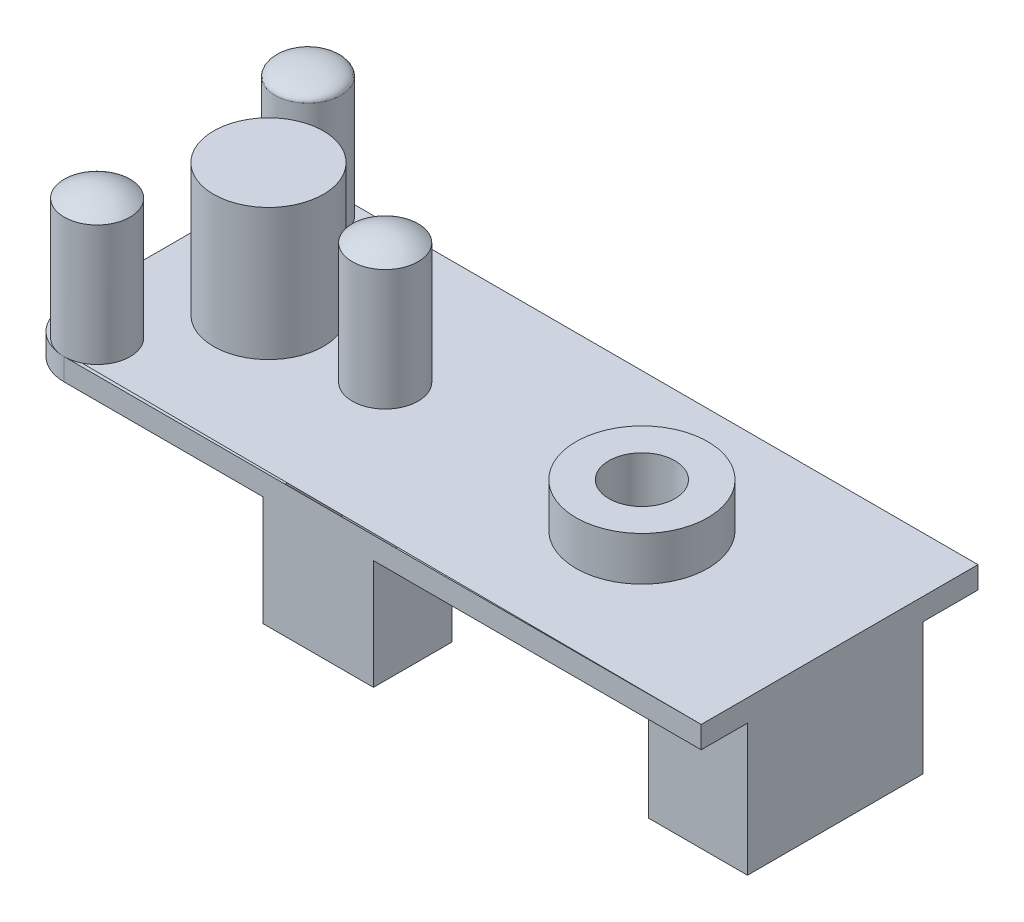
ISO-10303-21;
HEADER;
FILE_DESCRIPTION(('STEP AP214'),'2;1');
FILE_NAME('part.step','',(''),(''),'','','');
FILE_SCHEMA(('AUTOMOTIVE_DESIGN { 1 0 10303 214 1 1 1 1 }'));
ENDSEC;
DATA;
#1=APPLICATION_CONTEXT('core data for automotive mechanical design processes');
#2=APPLICATION_PROTOCOL_DEFINITION('international standard','automotive_design',2000,#1);
#3=PRODUCT_CONTEXT('',#1,'mechanical');
#4=PRODUCT('Part','Part','',(#3));
#5=PRODUCT_RELATED_PRODUCT_CATEGORY('part','',(#4));
#6=PRODUCT_DEFINITION_FORMATION('','',#4);
#7=PRODUCT_DEFINITION_CONTEXT('part definition',#1,'design');
#8=PRODUCT_DEFINITION('design','',#6,#7);
#9=PRODUCT_DEFINITION_SHAPE('','',#8);
#10=(LENGTH_UNIT() NAMED_UNIT(*) SI_UNIT(.MILLI.,.METRE.));
#11=(NAMED_UNIT(*) PLANE_ANGLE_UNIT() SI_UNIT($,.RADIAN.));
#12=(NAMED_UNIT(*) SI_UNIT($,.STERADIAN.) SOLID_ANGLE_UNIT());
#13=UNCERTAINTY_MEASURE_WITH_UNIT(LENGTH_MEASURE(1.E-05),#10,'distance_accuracy_value','');
#14=(GEOMETRIC_REPRESENTATION_CONTEXT(3) GLOBAL_UNCERTAINTY_ASSIGNED_CONTEXT((#13)) GLOBAL_UNIT_ASSIGNED_CONTEXT((#10,
#11,#12)) REPRESENTATION_CONTEXT('',''));
#15=CARTESIAN_POINT('',(0.,0.,0.));
#16=DIRECTION('',(0.,0.,1.));
#17=DIRECTION('',(1.,0.,0.));
#18=AXIS2_PLACEMENT_3D('',#15,#16,#17);
#19=CARTESIAN_POINT('',(0.,0.,0.));
#20=DIRECTION('',(0.,1.,0.));
#21=DIRECTION('',(0.,0.,1.));
#22=AXIS2_PLACEMENT_3D('',#19,#20,#21);
#23=PLANE('',#22);
#24=CARTESIAN_POINT('',(6.5,0.,0.));
#25=DIRECTION('',(0.,1.,0.));
#26=DIRECTION('',(0.,0.,1.));
#27=AXIS2_PLACEMENT_3D('',#24,#25,#26);
#28=CIRCLE('',#27,1.5);
#29=CARTESIAN_POINT('',(6.5,0.,1.5));
#30=VERTEX_POINT('',#29);
#31=EDGE_CURVE('E421',#30,#30,#28,.T.);
#32=ORIENTED_EDGE('',*,*,#31,.T.);
#33=EDGE_LOOP('',(#32));
#34=FACE_BOUND('',#33,.T.);
#35=DIRECTION('',(0.,0.,-1.));
#36=VECTOR('',#35,1.);
#37=CARTESIAN_POINT('',(-4.44020088302612,0.,6.3));
#38=LINE('',#37,#36);
#39=CARTESIAN_POINT('',(-4.44020088302612,0.,6.3));
#40=VERTEX_POINT('',#39);
#41=CARTESIAN_POINT('',(-4.44020088302612,0.,2.71883396460657));
#42=VERTEX_POINT('',#41);
#43=EDGE_CURVE('E185',#40,#42,#38,.T.);
#44=ORIENTED_EDGE('',*,*,#43,.F.);
#45=DIRECTION('',(1.,0.,0.));
#46=VECTOR('',#45,1.);
#47=CARTESIAN_POINT('',(-15.5,0.,6.3));
#48=LINE('',#47,#46);
#49=CARTESIAN_POINT('',(-13.5,0.,6.3));
#50=VERTEX_POINT('',#49);
#51=EDGE_CURVE('E311',#50,#40,#48,.T.);
#52=ORIENTED_EDGE('',*,*,#51,.F.);
#53=CARTESIAN_POINT('',(-13.5,0.,4.3));
#54=DIRECTION('',(0.,1.,0.));
#55=DIRECTION('',(0.,0.,1.));
#56=AXIS2_PLACEMENT_3D('',#53,#54,#55);
#57=CIRCLE('',#56,2.);
#58=CARTESIAN_POINT('',(-15.5,0.,4.3));
#59=VERTEX_POINT('',#58);
#60=EDGE_CURVE('E251',#50,#59,#57,.F.);
#61=ORIENTED_EDGE('',*,*,#60,.T.);
#62=DIRECTION('',(0.,0.,1.));
#63=VECTOR('',#62,1.);
#64=CARTESIAN_POINT('',(-15.5,0.,-6.3));
#65=LINE('',#64,#63);
#66=CARTESIAN_POINT('',(-15.5,0.,-4.3));
#67=VERTEX_POINT('',#66);
#68=EDGE_CURVE('E689',#67,#59,#65,.T.);
#69=ORIENTED_EDGE('',*,*,#68,.F.);
#70=CARTESIAN_POINT('',(-13.5,0.,-4.3));
#71=DIRECTION('',(0.,1.,0.));
#72=DIRECTION('',(0.,0.,1.));
#73=AXIS2_PLACEMENT_3D('',#70,#71,#72);
#74=CIRCLE('',#73,2.);
#75=CARTESIAN_POINT('',(-13.5,0.,-6.3));
#76=VERTEX_POINT('',#75);
#77=EDGE_CURVE('E57',#67,#76,#74,.F.);
#78=ORIENTED_EDGE('',*,*,#77,.T.);
#79=DIRECTION('',(-1.,0.,0.));
#80=VECTOR('',#79,1.);
#81=CARTESIAN_POINT('',(-15.5,0.,-6.3));
#82=LINE('',#81,#80);
#83=CARTESIAN_POINT('',(15.5,0.,-6.3));
#84=VERTEX_POINT('',#83);
#85=EDGE_CURVE('E284',#84,#76,#82,.T.);
#86=ORIENTED_EDGE('',*,*,#85,.F.);
#87=DIRECTION('',(0.,0.,-1.));
#88=VECTOR('',#87,1.);
#89=CARTESIAN_POINT('',(15.5,0.,-6.3));
#90=LINE('',#89,#88);
#91=CARTESIAN_POINT('',(15.5,0.,-3.80656899501454));
#92=VERTEX_POINT('',#91);
#93=EDGE_CURVE('E305',#92,#84,#90,.T.);
#94=ORIENTED_EDGE('',*,*,#93,.F.);
#95=DIRECTION('',(1.,0.,0.));
#96=VECTOR('',#95,1.);
#97=CARTESIAN_POINT('',(11.,0.,-3.80656899501453));
#98=LINE('',#97,#96);
#99=CARTESIAN_POINT('',(11.,0.,-3.80656899501453));
#100=VERTEX_POINT('',#99);
#101=EDGE_CURVE('E217',#100,#92,#98,.T.);
#102=ORIENTED_EDGE('',*,*,#101,.F.);
#103=DIRECTION('',(0.,0.,-1.));
#104=VECTOR('',#103,1.);
#105=CARTESIAN_POINT('',(10.9999999999999,0.,4.19343100498547));
#106=LINE('',#105,#104);
#107=CARTESIAN_POINT('',(10.9999999999999,0.,4.19343100498547));
#108=VERTEX_POINT('',#107);
#109=EDGE_CURVE('E228',#108,#100,#106,.T.);
#110=ORIENTED_EDGE('',*,*,#109,.F.);
#111=DIRECTION('',(-1.,0.,0.));
#112=VECTOR('',#111,1.);
#113=CARTESIAN_POINT('',(15.5,0.,4.19343100498549));
#114=LINE('',#113,#112);
#115=CARTESIAN_POINT('',(15.5,0.,4.19343100498548));
#116=VERTEX_POINT('',#115);
#117=EDGE_CURVE('E242',#116,#108,#114,.T.);
#118=ORIENTED_EDGE('',*,*,#117,.F.);
#119=CARTESIAN_POINT('',(15.5,0.,6.3));
#120=VERTEX_POINT('',#119);
#121=EDGE_CURVE('E322',#120,#116,#90,.T.);
#122=ORIENTED_EDGE('',*,*,#121,.F.);
#123=CARTESIAN_POINT('',(0.579184897786012,0.,6.3));
#124=VERTEX_POINT('',#123);
#125=EDGE_CURVE('E688',#124,#120,#48,.T.);
#126=ORIENTED_EDGE('',*,*,#125,.F.);
#127=DIRECTION('',(0.,0.,1.));
#128=VECTOR('',#127,1.);
#129=CARTESIAN_POINT('',(0.579184897786012,0.,6.3));
#130=LINE('',#129,#128);
#131=CARTESIAN_POINT('',(0.579184897786012,0.,2.71883396460657));
#132=VERTEX_POINT('',#131);
#133=EDGE_CURVE('E181',#132,#124,#130,.T.);
#134=ORIENTED_EDGE('',*,*,#133,.F.);
#135=DIRECTION('',(1.,0.,0.));
#136=VECTOR('',#135,1.);
#137=CARTESIAN_POINT('',(-4.44020088302612,0.,2.71883396460657));
#138=LINE('',#137,#136);
#139=EDGE_CURVE('E686',#42,#132,#138,.T.);
#140=ORIENTED_EDGE('',*,*,#139,.F.);
#141=EDGE_LOOP('',(#44,#52,#61,#69,#78,#86,#94,#102,#110,#118,#122,#126,#134,#140));
#142=FACE_BOUND('',#141,.T.);
#143=ADVANCED_FACE('F34',(#34,#142),#23,.F.);
#144=CARTESIAN_POINT('',(0.,1.,0.));
#145=DIRECTION('',(0.,1.,0.));
#146=DIRECTION('',(0.,0.,1.));
#147=AXIS2_PLACEMENT_3D('',#144,#145,#146);
#148=PLANE('',#147);
#149=CARTESIAN_POINT('',(-5.1861561236694,1.,0.));
#150=DIRECTION('',(0.,1.,0.));
#151=DIRECTION('',(0.,0.,1.));
#152=AXIS2_PLACEMENT_3D('',#149,#150,#151);
#153=CIRCLE('',#152,1.5);
#154=CARTESIAN_POINT('',(-5.1861561236694,1.,1.5));
#155=VERTEX_POINT('',#154);
#156=EDGE_CURVE('E294',#155,#155,#153,.T.);
#157=ORIENTED_EDGE('',*,*,#156,.F.);
#158=EDGE_LOOP('',(#157));
#159=FACE_BOUND('',#158,.T.);
#160=CARTESIAN_POINT('',(-10.5,1.,0.));
#161=DIRECTION('',(0.,1.,0.));
#162=DIRECTION('',(0.,0.,1.));
#163=AXIS2_PLACEMENT_3D('',#160,#161,#162);
#164=CIRCLE('',#163,2.5);
#165=CARTESIAN_POINT('',(-10.5,1.,2.5));
#166=VERTEX_POINT('',#165);
#167=EDGE_CURVE('E306',#166,#166,#164,.T.);
#168=ORIENTED_EDGE('',*,*,#167,.F.);
#169=EDGE_LOOP('',(#168));
#170=FACE_BOUND('',#169,.T.);
#171=CARTESIAN_POINT('',(-13.5,1.,-4.8));
#172=DIRECTION('',(0.,1.,0.));
#173=DIRECTION('',(0.,0.,-1.));
#174=AXIS2_PLACEMENT_3D('',#171,#172,#173);
#175=CIRCLE('',#174,1.5);
#176=CARTESIAN_POINT('',(-13.5,1.,-6.3));
#177=VERTEX_POINT('',#176);
#178=EDGE_CURVE('E268',#177,#177,#175,.T.);
#179=ORIENTED_EDGE('',*,*,#178,.F.);
#180=CARTESIAN_POINT('',(-13.5,1.,-4.3));
#181=DIRECTION('',(0.,1.,0.));
#182=DIRECTION('',(0.,0.,1.));
#183=AXIS2_PLACEMENT_3D('',#180,#181,#182);
#184=CIRCLE('',#183,2.);
#185=CARTESIAN_POINT('',(-15.5,1.,-4.3));
#186=VERTEX_POINT('',#185);
#187=EDGE_CURVE('E42',#177,#186,#184,.T.);
#188=ORIENTED_EDGE('',*,*,#187,.T.);
#189=DIRECTION('',(0.,0.,1.));
#190=VECTOR('',#189,1.);
#191=CARTESIAN_POINT('',(-15.5,1.,-6.3));
#192=LINE('',#191,#190);
#193=CARTESIAN_POINT('',(-15.5,1.,4.3));
#194=VERTEX_POINT('',#193);
#195=EDGE_CURVE('E264',#186,#194,#192,.T.);
#196=ORIENTED_EDGE('',*,*,#195,.T.);
#197=CARTESIAN_POINT('',(-13.5,1.,4.3));
#198=DIRECTION('',(0.,1.,0.));
#199=DIRECTION('',(0.,0.,1.));
#200=AXIS2_PLACEMENT_3D('',#197,#198,#199);
#201=CIRCLE('',#200,2.);
#202=CARTESIAN_POINT('',(-13.5,1.,6.3));
#203=VERTEX_POINT('',#202);
#204=EDGE_CURVE('E256',#194,#203,#201,.T.);
#205=ORIENTED_EDGE('',*,*,#204,.T.);
#206=CARTESIAN_POINT('',(-13.5,1.,4.8));
#207=DIRECTION('',(0.,1.,0.));
#208=DIRECTION('',(0.,0.,1.));
#209=AXIS2_PLACEMENT_3D('',#206,#207,#208);
#210=CIRCLE('',#209,1.5);
#211=EDGE_CURVE('E291',#203,#203,#210,.T.);
#212=ORIENTED_EDGE('',*,*,#211,.F.);
#213=DIRECTION('',(1.,0.,0.));
#214=VECTOR('',#213,1.);
#215=CARTESIAN_POINT('',(-15.5,1.,6.3));
#216=LINE('',#215,#214);
#217=CARTESIAN_POINT('',(15.5,1.,6.3));
#218=VERTEX_POINT('',#217);
#219=EDGE_CURVE('E276',#203,#218,#216,.T.);
#220=ORIENTED_EDGE('',*,*,#219,.T.);
#221=DIRECTION('',(0.,0.,-1.));
#222=VECTOR('',#221,1.);
#223=CARTESIAN_POINT('',(15.5,1.,-6.3));
#224=LINE('',#223,#222);
#225=CARTESIAN_POINT('',(15.5,1.,-6.3));
#226=VERTEX_POINT('',#225);
#227=EDGE_CURVE('E309',#218,#226,#224,.T.);
#228=ORIENTED_EDGE('',*,*,#227,.T.);
#229=DIRECTION('',(-1.,0.,0.));
#230=VECTOR('',#229,1.);
#231=CARTESIAN_POINT('',(-15.5,1.,-6.3));
#232=LINE('',#231,#230);
#233=EDGE_CURVE('E277',#226,#177,#232,.T.);
#234=ORIENTED_EDGE('',*,*,#233,.T.);
#235=EDGE_LOOP('',(#179,#188,#196,#205,#212,#220,#228,#234));
#236=FACE_BOUND('',#235,.T.);
#237=CARTESIAN_POINT('',(6.5,1.,0.));
#238=DIRECTION('',(0.,1.,0.));
#239=DIRECTION('',(0.,0.,1.));
#240=AXIS2_PLACEMENT_3D('',#237,#238,#239);
#241=CIRCLE('',#240,3.);
#242=CARTESIAN_POINT('',(6.5,1.,3.));
#243=VERTEX_POINT('',#242);
#244=EDGE_CURVE('E417',#243,#243,#241,.T.);
#245=ORIENTED_EDGE('',*,*,#244,.F.);
#246=EDGE_LOOP('',(#245));
#247=FACE_BOUND('',#246,.T.);
#248=ADVANCED_FACE('F262',(#159,#170,#236,#247),#148,.T.);
#249=CARTESIAN_POINT('',(15.5,1.,-6.3));
#250=DIRECTION('',(-1.,0.,0.));
#251=DIRECTION('',(0.,0.,1.));
#252=AXIS2_PLACEMENT_3D('',#249,#250,#251);
#253=PLANE('',#252);
#254=ORIENTED_EDGE('',*,*,#121,.T.);
#255=DIRECTION('',(0.,1.,0.));
#256=VECTOR('',#255,1.);
#257=CARTESIAN_POINT('',(15.5,-6.,4.19343100498549));
#258=LINE('',#257,#256);
#259=CARTESIAN_POINT('',(15.5,-6.,4.19343100498549));
#260=VERTEX_POINT('',#259);
#261=EDGE_CURVE('E384',#260,#116,#258,.T.);
#262=ORIENTED_EDGE('',*,*,#261,.F.);
#263=DIRECTION('',(0.,0.,1.));
#264=VECTOR('',#263,1.);
#265=CARTESIAN_POINT('',(15.5,-6.,-3.80656899501454));
#266=LINE('',#265,#264);
#267=CARTESIAN_POINT('',(15.5,-6.,-3.80656899501454));
#268=VERTEX_POINT('',#267);
#269=EDGE_CURVE('E227',#268,#260,#266,.T.);
#270=ORIENTED_EDGE('',*,*,#269,.F.);
#271=DIRECTION('',(0.,1.,0.));
#272=VECTOR('',#271,1.);
#273=CARTESIAN_POINT('',(15.5,-6.,-3.80656899501454));
#274=LINE('',#273,#272);
#275=EDGE_CURVE('E394',#268,#92,#274,.T.);
#276=ORIENTED_EDGE('',*,*,#275,.T.);
#277=ORIENTED_EDGE('',*,*,#93,.T.);
#278=DIRECTION('',(0.,-1.,0.));
#279=VECTOR('',#278,1.);
#280=CARTESIAN_POINT('',(15.5,1.,-6.3));
#281=LINE('',#280,#279);
#282=EDGE_CURVE('E248',#226,#84,#281,.T.);
#283=ORIENTED_EDGE('',*,*,#282,.F.);
#284=ORIENTED_EDGE('',*,*,#227,.F.);
#285=DIRECTION('',(0.,-1.,0.));
#286=VECTOR('',#285,1.);
#287=CARTESIAN_POINT('',(15.5,1.,6.3));
#288=LINE('',#287,#286);
#289=EDGE_CURVE('E314',#218,#120,#288,.T.);
#290=ORIENTED_EDGE('',*,*,#289,.T.);
#291=EDGE_LOOP('',(#254,#262,#270,#276,#277,#283,#284,#290));
#292=FACE_BOUND('',#291,.T.);
#293=ADVANCED_FACE('F336',(#292),#253,.F.);
#294=CARTESIAN_POINT('',(-15.5,1.,-6.3));
#295=DIRECTION('',(0.,0.,1.));
#296=DIRECTION('',(1.,0.,0.));
#297=AXIS2_PLACEMENT_3D('',#294,#295,#296);
#298=PLANE('',#297);
#299=ORIENTED_EDGE('',*,*,#85,.T.);
#300=DIRECTION('',(0.,-1.,0.));
#301=VECTOR('',#300,1.);
#302=CARTESIAN_POINT('',(-13.5,1.,-6.3));
#303=LINE('',#302,#301);
#304=EDGE_CURVE('E254',#76,#177,#303,.F.);
#305=ORIENTED_EDGE('',*,*,#304,.T.);
#306=ORIENTED_EDGE('',*,*,#233,.F.);
#307=ORIENTED_EDGE('',*,*,#282,.T.);
#308=EDGE_LOOP('',(#299,#305,#306,#307));
#309=FACE_BOUND('',#308,.T.);
#310=ADVANCED_FACE('F281',(#309),#298,.F.);
#311=CARTESIAN_POINT('',(-15.5,1.,-6.3));
#312=DIRECTION('',(1.,0.,0.));
#313=DIRECTION('',(0.,0.,-1.));
#314=AXIS2_PLACEMENT_3D('',#311,#312,#313);
#315=PLANE('',#314);
#316=ORIENTED_EDGE('',*,*,#195,.F.);
#317=DIRECTION('',(0.,-1.,0.));
#318=VECTOR('',#317,1.);
#319=CARTESIAN_POINT('',(-15.5,1.,-4.3));
#320=LINE('',#319,#318);
#321=EDGE_CURVE('E247',#186,#67,#320,.T.);
#322=ORIENTED_EDGE('',*,*,#321,.T.);
#323=ORIENTED_EDGE('',*,*,#68,.T.);
#324=DIRECTION('',(0.,-1.,0.));
#325=VECTOR('',#324,1.);
#326=CARTESIAN_POINT('',(-15.5,1.,4.3));
#327=LINE('',#326,#325);
#328=EDGE_CURVE('E245',#59,#194,#327,.F.);
#329=ORIENTED_EDGE('',*,*,#328,.T.);
#330=EDGE_LOOP('',(#316,#322,#323,#329));
#331=FACE_BOUND('',#330,.T.);
#332=ADVANCED_FACE('F273',(#331),#315,.F.);
#333=CARTESIAN_POINT('',(-15.5,1.,6.3));
#334=DIRECTION('',(0.,0.,-1.));
#335=DIRECTION('',(-1.,0.,0.));
#336=AXIS2_PLACEMENT_3D('',#333,#334,#335);
#337=PLANE('',#336);
#338=ORIENTED_EDGE('',*,*,#219,.F.);
#339=DIRECTION('',(0.,-1.,0.));
#340=VECTOR('',#339,1.);
#341=CARTESIAN_POINT('',(-13.5,1.,6.3));
#342=LINE('',#341,#340);
#343=EDGE_CURVE('E11',#203,#50,#342,.T.);
#344=ORIENTED_EDGE('',*,*,#343,.T.);
#345=ORIENTED_EDGE('',*,*,#51,.T.);
#346=DIRECTION('',(0.,1.,0.));
#347=VECTOR('',#346,1.);
#348=CARTESIAN_POINT('',(-4.44020088302612,-5.,6.3));
#349=LINE('',#348,#347);
#350=CARTESIAN_POINT('',(-4.44020088302612,-5.,6.3));
#351=VERTEX_POINT('',#350);
#352=EDGE_CURVE('E699',#351,#40,#349,.T.);
#353=ORIENTED_EDGE('',*,*,#352,.F.);
#354=DIRECTION('',(-1.,0.,0.));
#355=VECTOR('',#354,1.);
#356=CARTESIAN_POINT('',(-4.44020088302612,-5.,6.3));
#357=LINE('',#356,#355);
#358=CARTESIAN_POINT('',(0.579184897786012,-5.,6.3));
#359=VERTEX_POINT('',#358);
#360=EDGE_CURVE('E178',#359,#351,#357,.T.);
#361=ORIENTED_EDGE('',*,*,#360,.F.);
#362=DIRECTION('',(0.,1.,0.));
#363=VECTOR('',#362,1.);
#364=CARTESIAN_POINT('',(0.579184897786012,-5.,6.3));
#365=LINE('',#364,#363);
#366=EDGE_CURVE('E49',#359,#124,#365,.T.);
#367=ORIENTED_EDGE('',*,*,#366,.T.);
#368=ORIENTED_EDGE('',*,*,#125,.T.);
#369=ORIENTED_EDGE('',*,*,#289,.F.);
#370=EDGE_LOOP('',(#338,#344,#345,#353,#361,#367,#368,#369));
#371=FACE_BOUND('',#370,.T.);
#372=ADVANCED_FACE('F368',(#371),#337,.F.);
#373=CARTESIAN_POINT('',(-10.5,7.,0.));
#374=DIRECTION('',(0.,-1.,0.));
#375=DIRECTION('',(0.,0.,-1.));
#376=AXIS2_PLACEMENT_3D('',#373,#374,#375);
#377=CYLINDRICAL_SURFACE('',#376,2.5);
#378=CARTESIAN_POINT('',(-10.5,7.,0.));
#379=DIRECTION('',(0.,1.,0.));
#380=DIRECTION('',(0.,0.,1.));
#381=AXIS2_PLACEMENT_3D('',#378,#379,#380);
#382=CIRCLE('',#381,2.5);
#383=CARTESIAN_POINT('',(-10.5,7.,2.5));
#384=VERTEX_POINT('',#383);
#385=EDGE_CURVE('E302',#384,#384,#382,.T.);
#386=ORIENTED_EDGE('',*,*,#385,.F.);
#387=EDGE_LOOP('',(#386));
#388=FACE_BOUND('',#387,.T.);
#389=ORIENTED_EDGE('',*,*,#167,.T.);
#390=EDGE_LOOP('',(#389));
#391=FACE_BOUND('',#390,.T.);
#392=ADVANCED_FACE('F371',(#388,#391),#377,.T.);
#393=CARTESIAN_POINT('',(-10.5,7.,0.));
#394=DIRECTION('',(0.,1.,0.));
#395=DIRECTION('',(0.,0.,1.));
#396=AXIS2_PLACEMENT_3D('',#393,#394,#395);
#397=PLANE('',#396);
#398=ORIENTED_EDGE('',*,*,#385,.T.);
#399=EDGE_LOOP('',(#398));
#400=FACE_BOUND('',#399,.T.);
#401=ADVANCED_FACE('F431',(#400),#397,.T.);
#402=CARTESIAN_POINT('',(-13.5,6.5,4.8));
#403=DIRECTION('',(0.,-1.,0.));
#404=DIRECTION('',(0.,0.,-1.));
#405=AXIS2_PLACEMENT_3D('',#402,#403,#404);
#406=CYLINDRICAL_SURFACE('',#405,1.5);
#407=CARTESIAN_POINT('',(-13.5,6.5,4.8));
#408=DIRECTION('',(0.,1.,0.));
#409=DIRECTION('',(0.,0.,1.));
#410=AXIS2_PLACEMENT_3D('',#407,#408,#409);
#411=CIRCLE('',#410,1.5);
#412=CARTESIAN_POINT('',(-13.5,6.5,6.3));
#413=VERTEX_POINT('',#412);
#414=EDGE_CURVE('E301',#413,#413,#411,.T.);
#415=ORIENTED_EDGE('',*,*,#414,.F.);
#416=EDGE_LOOP('',(#415));
#417=FACE_BOUND('',#416,.T.);
#418=ORIENTED_EDGE('',*,*,#211,.T.);
#419=EDGE_LOOP('',(#418));
#420=FACE_BOUND('',#419,.T.);
#421=ADVANCED_FACE('F341',(#417,#420),#406,.T.);
#422=CARTESIAN_POINT('',(-13.5,4.5,4.8));
#423=DIRECTION('',(0.,0.,1.));
#424=DIRECTION('',(1.,0.,0.));
#425=AXIS2_PLACEMENT_3D('',#422,#423,#424);
#426=SPHERICAL_SURFACE('',#425,2.5);
#427=CARTESIAN_POINT('',(-13.5,4.5,4.8));
#428=DIRECTION('',(0.,1.,0.));
#429=DIRECTION('',(0.,0.,1.));
#430=AXIS2_PLACEMENT_3D('',#427,#428,#429);
#431=SPHERICAL_SURFACE('',#430,2.5);
#432=ORIENTED_EDGE('',*,*,#414,.T.);
#433=EDGE_LOOP('',(#432));
#434=FACE_BOUND('',#433,.T.);
#435=ADVANCED_FACE('F338',(#434),#431,.T.);
#436=CARTESIAN_POINT('',(-13.5,6.5,-4.8));
#437=DIRECTION('',(0.,-1.,0.));
#438=DIRECTION('',(0.,0.,-1.));
#439=AXIS2_PLACEMENT_3D('',#436,#437,#438);
#440=CYLINDRICAL_SURFACE('',#439,1.5);
#441=CARTESIAN_POINT('',(-13.5,6.5,-4.8));
#442=DIRECTION('',(0.,1.,0.));
#443=DIRECTION('',(0.,0.,-1.));
#444=AXIS2_PLACEMENT_3D('',#441,#442,#443);
#445=CIRCLE('',#444,1.5);
#446=CARTESIAN_POINT('',(-13.5,6.5,-6.3));
#447=VERTEX_POINT('',#446);
#448=EDGE_CURVE('E287',#447,#447,#445,.T.);
#449=ORIENTED_EDGE('',*,*,#448,.F.);
#450=EDGE_LOOP('',(#449));
#451=FACE_BOUND('',#450,.T.);
#452=ORIENTED_EDGE('',*,*,#178,.T.);
#453=EDGE_LOOP('',(#452));
#454=FACE_BOUND('',#453,.T.);
#455=ADVANCED_FACE('F286',(#451,#454),#440,.T.);
#456=CARTESIAN_POINT('',(-13.5,6.5,-4.8));
#457=DIRECTION('',(-1.,0.,0.));
#458=DIRECTION('',(0.,0.,-1.));
#459=AXIS2_PLACEMENT_3D('',#456,#457,#458);
#460=ELLIPSE('',#459,1.5,0.5);
#461=TRIMMED_CURVE('',#460,(PARAMETER_VALUE(4.71238898038469)),
(PARAMETER_VALUE(7.85398163397448)),.T.,.PARAMETER.);
#462=CARTESIAN_POINT('',(-13.5,6.,-4.8));
#463=DIRECTION('',(0.,1.,0.));
#464=AXIS1_PLACEMENT('',#462,#463);
#465=SURFACE_OF_REVOLUTION('',#461,#464);
#466=CARTESIAN_POINT('',(-13.5,7.,-4.8));
#467=VERTEX_POINT('',#466);
#468=VERTEX_LOOP('',#467);
#469=FACE_BOUND('',#468,.T.);
#470=ORIENTED_EDGE('',*,*,#448,.T.);
#471=EDGE_LOOP('',(#470));
#472=FACE_BOUND('',#471,.T.);
#473=ADVANCED_FACE('F330',(#469,#472),#465,.F.);
#474=CARTESIAN_POINT('',(-5.1861561236694,6.5,0.));
#475=DIRECTION('',(0.,-1.,0.));
#476=DIRECTION('',(0.,0.,-1.));
#477=AXIS2_PLACEMENT_3D('',#474,#475,#476);
#478=CYLINDRICAL_SURFACE('',#477,1.5);
#479=CARTESIAN_POINT('',(-5.1861561236694,6.5,0.));
#480=DIRECTION('',(0.,1.,0.));
#481=DIRECTION('',(0.,0.,1.));
#482=AXIS2_PLACEMENT_3D('',#479,#480,#481);
#483=CIRCLE('',#482,1.5);
#484=CARTESIAN_POINT('',(-5.1861561236694,6.5,1.5));
#485=VERTEX_POINT('',#484);
#486=EDGE_CURVE('E288',#485,#485,#483,.T.);
#487=ORIENTED_EDGE('',*,*,#486,.F.);
#488=EDGE_LOOP('',(#487));
#489=FACE_BOUND('',#488,.T.);
#490=ORIENTED_EDGE('',*,*,#156,.T.);
#491=EDGE_LOOP('',(#490));
#492=FACE_BOUND('',#491,.T.);
#493=ADVANCED_FACE('F334',(#489,#492),#478,.T.);
#494=CARTESIAN_POINT('',(-5.1861561236694,4.5,0.));
#495=DIRECTION('',(0.,0.,1.));
#496=DIRECTION('',(1.,0.,0.));
#497=AXIS2_PLACEMENT_3D('',#494,#495,#496);
#498=SPHERICAL_SURFACE('',#497,2.5);
#499=CARTESIAN_POINT('',(-5.1861561236694,4.5,0.));
#500=DIRECTION('',(0.,1.,0.));
#501=DIRECTION('',(0.,0.,1.));
#502=AXIS2_PLACEMENT_3D('',#499,#500,#501);
#503=SPHERICAL_SURFACE('',#502,2.5);
#504=ORIENTED_EDGE('',*,*,#486,.T.);
#505=EDGE_LOOP('',(#504));
#506=FACE_BOUND('',#505,.T.);
#507=ADVANCED_FACE('F343',(#506),#503,.T.);
#508=CARTESIAN_POINT('',(6.5,0.,0.));
#509=DIRECTION('',(0.,1.,0.));
#510=DIRECTION('',(0.,0.,1.));
#511=AXIS2_PLACEMENT_3D('',#508,#509,#510);
#512=CYLINDRICAL_SURFACE('',#511,1.5);
#513=ORIENTED_EDGE('',*,*,#31,.F.);
#514=EDGE_LOOP('',(#513));
#515=FACE_BOUND('',#514,.T.);
#516=CARTESIAN_POINT('',(6.5,3.,0.));
#517=DIRECTION('',(0.,1.,0.));
#518=DIRECTION('',(0.,0.,1.));
#519=AXIS2_PLACEMENT_3D('',#516,#517,#518);
#520=CIRCLE('',#519,1.5);
#521=CARTESIAN_POINT('',(6.5,3.,1.5));
#522=VERTEX_POINT('',#521);
#523=EDGE_CURVE('E398',#522,#522,#520,.T.);
#524=ORIENTED_EDGE('',*,*,#523,.T.);
#525=EDGE_LOOP('',(#524));
#526=FACE_BOUND('',#525,.T.);
#527=ADVANCED_FACE('F345',(#515,#526),#512,.F.);
#528=CARTESIAN_POINT('',(6.5,3.,0.));
#529=DIRECTION('',(0.,1.,0.));
#530=DIRECTION('',(0.,0.,1.));
#531=AXIS2_PLACEMENT_3D('',#528,#529,#530);
#532=PLANE('',#531);
#533=CARTESIAN_POINT('',(6.5,3.,0.));
#534=DIRECTION('',(0.,1.,0.));
#535=DIRECTION('',(0.,0.,1.));
#536=AXIS2_PLACEMENT_3D('',#533,#534,#535);
#537=CIRCLE('',#536,3.);
#538=CARTESIAN_POINT('',(6.5,3.,3.));
#539=VERTEX_POINT('',#538);
#540=EDGE_CURVE('E418',#539,#539,#537,.T.);
#541=ORIENTED_EDGE('',*,*,#540,.T.);
#542=EDGE_LOOP('',(#541));
#543=FACE_BOUND('',#542,.T.);
#544=ORIENTED_EDGE('',*,*,#523,.F.);
#545=EDGE_LOOP('',(#544));
#546=FACE_BOUND('',#545,.T.);
#547=ADVANCED_FACE('F451',(#543,#546),#532,.T.);
#548=CARTESIAN_POINT('',(6.5,3.,0.));
#549=DIRECTION('',(0.,-1.,0.));
#550=DIRECTION('',(0.,0.,-1.));
#551=AXIS2_PLACEMENT_3D('',#548,#549,#550);
#552=CYLINDRICAL_SURFACE('',#551,3.);
#553=ORIENTED_EDGE('',*,*,#540,.F.);
#554=EDGE_LOOP('',(#553));
#555=FACE_BOUND('',#554,.T.);
#556=ORIENTED_EDGE('',*,*,#244,.T.);
#557=EDGE_LOOP('',(#556));
#558=FACE_BOUND('',#557,.T.);
#559=ADVANCED_FACE('F453',(#555,#558),#552,.T.);
#560=CARTESIAN_POINT('',(11.,-6.,-3.80656899501453));
#561=DIRECTION('',(0.,0.,1.));
#562=DIRECTION('',(1.,0.,0.));
#563=AXIS2_PLACEMENT_3D('',#560,#561,#562);
#564=PLANE('',#563);
#565=ORIENTED_EDGE('',*,*,#101,.T.);
#566=ORIENTED_EDGE('',*,*,#275,.F.);
#567=DIRECTION('',(1.,0.,0.));
#568=VECTOR('',#567,1.);
#569=CARTESIAN_POINT('',(11.,-6.,-3.80656899501453));
#570=LINE('',#569,#568);
#571=CARTESIAN_POINT('',(11.,-6.,-3.80656899501453));
#572=VERTEX_POINT('',#571);
#573=EDGE_CURVE('E224',#572,#268,#570,.T.);
#574=ORIENTED_EDGE('',*,*,#573,.F.);
#575=DIRECTION('',(0.,1.,0.));
#576=VECTOR('',#575,1.);
#577=CARTESIAN_POINT('',(11.,-6.,-3.80656899501453));
#578=LINE('',#577,#576);
#579=EDGE_CURVE('E234',#572,#100,#578,.T.);
#580=ORIENTED_EDGE('',*,*,#579,.T.);
#581=EDGE_LOOP('',(#565,#566,#574,#580));
#582=FACE_BOUND('',#581,.T.);
#583=ADVANCED_FACE('F412',(#582),#564,.F.);
#584=CARTESIAN_POINT('',(15.5,-6.,4.19343100498549));
#585=DIRECTION('',(0.,0.,-1.));
#586=DIRECTION('',(-1.,0.,0.));
#587=AXIS2_PLACEMENT_3D('',#584,#585,#586);
#588=PLANE('',#587);
#589=ORIENTED_EDGE('',*,*,#117,.T.);
#590=DIRECTION('',(0.,1.,0.));
#591=VECTOR('',#590,1.);
#592=CARTESIAN_POINT('',(10.9999999999999,-6.,4.19343100498547));
#593=LINE('',#592,#591);
#594=CARTESIAN_POINT('',(10.9999999999999,-6.,4.19343100498547));
#595=VERTEX_POINT('',#594);
#596=EDGE_CURVE('E395',#595,#108,#593,.T.);
#597=ORIENTED_EDGE('',*,*,#596,.F.);
#598=DIRECTION('',(-1.,0.,0.));
#599=VECTOR('',#598,1.);
#600=CARTESIAN_POINT('',(15.5,-6.,4.19343100498549));
#601=LINE('',#600,#599);
#602=EDGE_CURVE('E230',#260,#595,#601,.T.);
#603=ORIENTED_EDGE('',*,*,#602,.F.);
#604=ORIENTED_EDGE('',*,*,#261,.T.);
#605=EDGE_LOOP('',(#589,#597,#603,#604));
#606=FACE_BOUND('',#605,.T.);
#607=ADVANCED_FACE('F391',(#606),#588,.F.);
#608=CARTESIAN_POINT('',(10.9999999999999,-6.,4.19343100498547));
#609=DIRECTION('',(1.,0.,0.));
#610=DIRECTION('',(0.,0.,-1.));
#611=AXIS2_PLACEMENT_3D('',#608,#609,#610);
#612=PLANE('',#611);
#613=ORIENTED_EDGE('',*,*,#109,.T.);
#614=ORIENTED_EDGE('',*,*,#579,.F.);
#615=DIRECTION('',(0.,0.,-1.));
#616=VECTOR('',#615,1.);
#617=CARTESIAN_POINT('',(10.9999999999999,-6.,4.19343100498547));
#618=LINE('',#617,#616);
#619=EDGE_CURVE('E232',#595,#572,#618,.T.);
#620=ORIENTED_EDGE('',*,*,#619,.F.);
#621=ORIENTED_EDGE('',*,*,#596,.T.);
#622=EDGE_LOOP('',(#613,#614,#620,#621));
#623=FACE_BOUND('',#622,.T.);
#624=ADVANCED_FACE('F408',(#623),#612,.F.);
#625=CARTESIAN_POINT('',(0.,-6.,0.));
#626=DIRECTION('',(0.,-1.,0.));
#627=DIRECTION('',(0.,0.,-1.));
#628=AXIS2_PLACEMENT_3D('',#625,#626,#627);
#629=PLANE('',#628);
#630=DIRECTION('',(0.,0.,1.));
#631=VECTOR('',#630,1.);
#632=CARTESIAN_POINT('',(14.9416183298104,-6.,3.44267255191247));
#633=LINE('',#632,#631);
#634=CARTESIAN_POINT('',(14.9416183298104,-6.,-3.05581054194153));
#635=VERTEX_POINT('',#634);
#636=CARTESIAN_POINT('',(14.9416183298104,-6.,3.44267255191247));
#637=VERTEX_POINT('',#636);
#638=EDGE_CURVE('E187',#635,#637,#633,.T.);
#639=ORIENTED_EDGE('',*,*,#638,.F.);
#640=DIRECTION('',(1.,0.,0.));
#641=VECTOR('',#640,1.);
#642=CARTESIAN_POINT('',(11.5583816701896,-6.,-3.05581054194153));
#643=LINE('',#642,#641);
#644=CARTESIAN_POINT('',(11.5583816701896,-6.,-3.05581054194153));
#645=VERTEX_POINT('',#644);
#646=EDGE_CURVE('E198',#645,#635,#643,.T.);
#647=ORIENTED_EDGE('',*,*,#646,.F.);
#648=DIRECTION('',(0.,0.,-1.));
#649=VECTOR('',#648,1.);
#650=CARTESIAN_POINT('',(11.5583816701896,-6.,3.44267255191247));
#651=LINE('',#650,#649);
#652=CARTESIAN_POINT('',(11.5583816701896,-6.,3.44267255191247));
#653=VERTEX_POINT('',#652);
#654=EDGE_CURVE('E210',#653,#645,#651,.T.);
#655=ORIENTED_EDGE('',*,*,#654,.F.);
#656=DIRECTION('',(-1.,0.,0.));
#657=VECTOR('',#656,1.);
#658=CARTESIAN_POINT('',(11.5583816701896,-6.,3.44267255191247));
#659=LINE('',#658,#657);
#660=EDGE_CURVE('E189',#637,#653,#659,.T.);
#661=ORIENTED_EDGE('',*,*,#660,.F.);
#662=EDGE_LOOP('',(#639,#647,#655,#661));
#663=FACE_BOUND('',#662,.T.);
#664=ORIENTED_EDGE('',*,*,#573,.T.);
#665=ORIENTED_EDGE('',*,*,#269,.T.);
#666=ORIENTED_EDGE('',*,*,#602,.T.);
#667=ORIENTED_EDGE('',*,*,#619,.T.);
#668=EDGE_LOOP('',(#664,#665,#666,#667));
#669=FACE_BOUND('',#668,.T.);
#670=ADVANCED_FACE('F466',(#663,#669),#629,.T.);
#671=CARTESIAN_POINT('',(14.9416183298104,-1.,3.44267255191247));
#672=DIRECTION('',(1.,0.,0.));
#673=DIRECTION('',(0.,0.,-1.));
#674=AXIS2_PLACEMENT_3D('',#671,#672,#673);
#675=PLANE('',#674);
#676=ORIENTED_EDGE('',*,*,#638,.T.);
#677=DIRECTION('',(0.,-1.,0.));
#678=VECTOR('',#677,1.);
#679=CARTESIAN_POINT('',(14.9416183298104,-1.,3.44267255191247));
#680=LINE('',#679,#678);
#681=CARTESIAN_POINT('',(14.9416183298104,-1.,3.44267255191247));
#682=VERTEX_POINT('',#681);
#683=EDGE_CURVE('E206',#682,#637,#680,.T.);
#684=ORIENTED_EDGE('',*,*,#683,.F.);
#685=DIRECTION('',(0.,0.,1.));
#686=VECTOR('',#685,1.);
#687=CARTESIAN_POINT('',(14.9416183298104,-1.,3.44267255191247));
#688=LINE('',#687,#686);
#689=CARTESIAN_POINT('',(14.9416183298104,-1.,-3.05581054194153));
#690=VERTEX_POINT('',#689);
#691=EDGE_CURVE('E194',#690,#682,#688,.T.);
#692=ORIENTED_EDGE('',*,*,#691,.F.);
#693=DIRECTION('',(0.,-1.,0.));
#694=VECTOR('',#693,1.);
#695=CARTESIAN_POINT('',(14.9416183298104,-1.,-3.05581054194153));
#696=LINE('',#695,#694);
#697=EDGE_CURVE('E215',#690,#635,#696,.T.);
#698=ORIENTED_EDGE('',*,*,#697,.T.);
#699=EDGE_LOOP('',(#676,#684,#692,#698));
#700=FACE_BOUND('',#699,.T.);
#701=ADVANCED_FACE('F469',(#700),#675,.F.);
#702=CARTESIAN_POINT('',(11.5583816701896,-1.,-3.05581054194153));
#703=DIRECTION('',(0.,0.,-1.));
#704=DIRECTION('',(-1.,0.,0.));
#705=AXIS2_PLACEMENT_3D('',#702,#703,#704);
#706=PLANE('',#705);
#707=ORIENTED_EDGE('',*,*,#646,.T.);
#708=ORIENTED_EDGE('',*,*,#697,.F.);
#709=DIRECTION('',(1.,0.,0.));
#710=VECTOR('',#709,1.);
#711=CARTESIAN_POINT('',(11.5583816701896,-1.,-3.05581054194153));
#712=LINE('',#711,#710);
#713=CARTESIAN_POINT('',(11.5583816701896,-1.,-3.05581054194153));
#714=VERTEX_POINT('',#713);
#715=EDGE_CURVE('E204',#714,#690,#712,.T.);
#716=ORIENTED_EDGE('',*,*,#715,.F.);
#717=DIRECTION('',(0.,-1.,0.));
#718=VECTOR('',#717,1.);
#719=CARTESIAN_POINT('',(11.5583816701896,-1.,-3.05581054194153));
#720=LINE('',#719,#718);
#721=EDGE_CURVE('E218',#714,#645,#720,.T.);
#722=ORIENTED_EDGE('',*,*,#721,.T.);
#723=EDGE_LOOP('',(#707,#708,#716,#722));
#724=FACE_BOUND('',#723,.T.);
#725=ADVANCED_FACE('F473',(#724),#706,.F.);
#726=CARTESIAN_POINT('',(11.5583816701896,-1.,3.44267255191247));
#727=DIRECTION('',(-1.,0.,0.));
#728=DIRECTION('',(0.,0.,1.));
#729=AXIS2_PLACEMENT_3D('',#726,#727,#728);
#730=PLANE('',#729);
#731=ORIENTED_EDGE('',*,*,#654,.T.);
#732=ORIENTED_EDGE('',*,*,#721,.F.);
#733=DIRECTION('',(0.,0.,-1.));
#734=VECTOR('',#733,1.);
#735=CARTESIAN_POINT('',(11.5583816701896,-1.,3.44267255191247));
#736=LINE('',#735,#734);
#737=CARTESIAN_POINT('',(11.5583816701896,-1.,3.44267255191247));
#738=VERTEX_POINT('',#737);
#739=EDGE_CURVE('E201',#738,#714,#736,.T.);
#740=ORIENTED_EDGE('',*,*,#739,.F.);
#741=DIRECTION('',(0.,-1.,0.));
#742=VECTOR('',#741,1.);
#743=CARTESIAN_POINT('',(11.5583816701896,-1.,3.44267255191247));
#744=LINE('',#743,#742);
#745=EDGE_CURVE('E220',#738,#653,#744,.T.);
#746=ORIENTED_EDGE('',*,*,#745,.T.);
#747=EDGE_LOOP('',(#731,#732,#740,#746));
#748=FACE_BOUND('',#747,.T.);
#749=ADVANCED_FACE('F477',(#748),#730,.F.);
#750=CARTESIAN_POINT('',(11.5583816701896,-1.,3.44267255191247));
#751=DIRECTION('',(0.,0.,1.));
#752=DIRECTION('',(1.,0.,0.));
#753=AXIS2_PLACEMENT_3D('',#750,#751,#752);
#754=PLANE('',#753);
#755=ORIENTED_EDGE('',*,*,#660,.T.);
#756=ORIENTED_EDGE('',*,*,#745,.F.);
#757=DIRECTION('',(-1.,0.,0.));
#758=VECTOR('',#757,1.);
#759=CARTESIAN_POINT('',(11.5583816701896,-1.,3.44267255191247));
#760=LINE('',#759,#758);
#761=EDGE_CURVE('E197',#682,#738,#760,.T.);
#762=ORIENTED_EDGE('',*,*,#761,.F.);
#763=ORIENTED_EDGE('',*,*,#683,.T.);
#764=EDGE_LOOP('',(#755,#756,#762,#763));
#765=FACE_BOUND('',#764,.T.);
#766=ADVANCED_FACE('F354',(#765),#754,.F.);
#767=CARTESIAN_POINT('',(0.,-1.,0.));
#768=DIRECTION('',(0.,-1.,0.));
#769=DIRECTION('',(0.,0.,-1.));
#770=AXIS2_PLACEMENT_3D('',#767,#768,#769);
#771=PLANE('',#770);
#772=ORIENTED_EDGE('',*,*,#691,.T.);
#773=ORIENTED_EDGE('',*,*,#761,.T.);
#774=ORIENTED_EDGE('',*,*,#739,.T.);
#775=ORIENTED_EDGE('',*,*,#715,.T.);
#776=EDGE_LOOP('',(#772,#773,#774,#775));
#777=FACE_BOUND('',#776,.T.);
#778=ADVANCED_FACE('F348',(#777),#771,.T.);
#779=CARTESIAN_POINT('',(-13.5,1.,-4.3));
#780=DIRECTION('',(0.,-1.,0.));
#781=DIRECTION('',(0.,0.,-1.));
#782=AXIS2_PLACEMENT_3D('',#779,#780,#781);
#783=CYLINDRICAL_SURFACE('',#782,2.);
#784=ORIENTED_EDGE('',*,*,#187,.F.);
#785=ORIENTED_EDGE('',*,*,#304,.F.);
#786=ORIENTED_EDGE('',*,*,#77,.F.);
#787=ORIENTED_EDGE('',*,*,#321,.F.);
#788=EDGE_LOOP('',(#784,#785,#786,#787));
#789=FACE_BOUND('',#788,.T.);
#790=ADVANCED_FACE('F279',(#789),#783,.T.);
#791=CARTESIAN_POINT('',(-13.5,1.,4.3));
#792=DIRECTION('',(0.,-1.,0.));
#793=DIRECTION('',(0.,0.,-1.));
#794=AXIS2_PLACEMENT_3D('',#791,#792,#793);
#795=CYLINDRICAL_SURFACE('',#794,2.);
#796=ORIENTED_EDGE('',*,*,#204,.F.);
#797=ORIENTED_EDGE('',*,*,#328,.F.);
#798=ORIENTED_EDGE('',*,*,#60,.F.);
#799=ORIENTED_EDGE('',*,*,#343,.F.);
#800=EDGE_LOOP('',(#796,#797,#798,#799));
#801=FACE_BOUND('',#800,.T.);
#802=ADVANCED_FACE('F36',(#801),#795,.T.);
#803=CARTESIAN_POINT('',(-4.44020088302612,-5.,6.3));
#804=DIRECTION('',(1.,0.,0.));
#805=DIRECTION('',(0.,0.,-1.));
#806=AXIS2_PLACEMENT_3D('',#803,#804,#805);
#807=PLANE('',#806);
#808=ORIENTED_EDGE('',*,*,#43,.T.);
#809=DIRECTION('',(0.,1.,0.));
#810=VECTOR('',#809,1.);
#811=CARTESIAN_POINT('',(-4.44020088302612,-5.,2.71883396460657));
#812=LINE('',#811,#810);
#813=CARTESIAN_POINT('',(-4.44020088302612,-5.,2.71883396460657));
#814=VERTEX_POINT('',#813);
#815=EDGE_CURVE('E167',#814,#42,#812,.T.);
#816=ORIENTED_EDGE('',*,*,#815,.F.);
#817=DIRECTION('',(0.,0.,-1.));
#818=VECTOR('',#817,1.);
#819=CARTESIAN_POINT('',(-4.44020088302612,-5.,6.3));
#820=LINE('',#819,#818);
#821=EDGE_CURVE('E174',#351,#814,#820,.T.);
#822=ORIENTED_EDGE('',*,*,#821,.F.);
#823=ORIENTED_EDGE('',*,*,#352,.T.);
#824=EDGE_LOOP('',(#808,#816,#822,#823));
#825=FACE_BOUND('',#824,.T.);
#826=ADVANCED_FACE('F183',(#825),#807,.F.);
#827=CARTESIAN_POINT('',(-4.44020088302612,-5.,2.71883396460657));
#828=DIRECTION('',(0.,0.,1.));
#829=DIRECTION('',(1.,0.,0.));
#830=AXIS2_PLACEMENT_3D('',#827,#828,#829);
#831=PLANE('',#830);
#832=ORIENTED_EDGE('',*,*,#139,.T.);
#833=DIRECTION('',(0.,1.,0.));
#834=VECTOR('',#833,1.);
#835=CARTESIAN_POINT('',(0.579184897786012,-5.,2.71883396460657));
#836=LINE('',#835,#834);
#837=CARTESIAN_POINT('',(0.579184897786012,-5.,2.71883396460657));
#838=VERTEX_POINT('',#837);
#839=EDGE_CURVE('E170',#838,#132,#836,.T.);
#840=ORIENTED_EDGE('',*,*,#839,.F.);
#841=DIRECTION('',(1.,0.,0.));
#842=VECTOR('',#841,1.);
#843=CARTESIAN_POINT('',(-4.44020088302612,-5.,2.71883396460657));
#844=LINE('',#843,#842);
#845=EDGE_CURVE('E163',#814,#838,#844,.T.);
#846=ORIENTED_EDGE('',*,*,#845,.F.);
#847=ORIENTED_EDGE('',*,*,#815,.T.);
#848=EDGE_LOOP('',(#832,#840,#846,#847));
#849=FACE_BOUND('',#848,.T.);
#850=ADVANCED_FACE('F165',(#849),#831,.F.);
#851=CARTESIAN_POINT('',(0.579184897786012,-5.,6.3));
#852=DIRECTION('',(-1.,0.,0.));
#853=DIRECTION('',(0.,0.,1.));
#854=AXIS2_PLACEMENT_3D('',#851,#852,#853);
#855=PLANE('',#854);
#856=ORIENTED_EDGE('',*,*,#133,.T.);
#857=ORIENTED_EDGE('',*,*,#366,.F.);
#858=DIRECTION('',(0.,0.,1.));
#859=VECTOR('',#858,1.);
#860=CARTESIAN_POINT('',(0.579184897786012,-5.,6.3));
#861=LINE('',#860,#859);
#862=EDGE_CURVE('E173',#838,#359,#861,.T.);
#863=ORIENTED_EDGE('',*,*,#862,.F.);
#864=ORIENTED_EDGE('',*,*,#839,.T.);
#865=EDGE_LOOP('',(#856,#857,#863,#864));
#866=FACE_BOUND('',#865,.T.);
#867=ADVANCED_FACE('F489',(#866),#855,.F.);
#868=CARTESIAN_POINT('',(0.,-5.,0.));
#869=DIRECTION('',(0.,-1.,0.));
#870=DIRECTION('',(0.,0.,-1.));
#871=AXIS2_PLACEMENT_3D('',#868,#869,#870);
#872=PLANE('',#871);
#873=ORIENTED_EDGE('',*,*,#821,.T.);
#874=ORIENTED_EDGE('',*,*,#845,.T.);
#875=ORIENTED_EDGE('',*,*,#862,.T.);
#876=ORIENTED_EDGE('',*,*,#360,.T.);
#877=EDGE_LOOP('',(#873,#874,#875,#876));
#878=FACE_BOUND('',#877,.T.);
#879=ADVANCED_FACE('F177',(#878),#872,.T.);
#880=CLOSED_SHELL('',(#143,#248,#293,#310,#332,#372,#392,#401,#421,#435,#455,#473,#493,#507,
#527,#547,#559,#583,#607,#624,#670,#701,#725,#749,#766,#778,#790,#802,#826,#850,#867,#879));
#881=MANIFOLD_SOLID_BREP('B2',#880);
#882=ADVANCED_BREP_SHAPE_REPRESENTATION('',(#18,#881),#14);
#883=SHAPE_DEFINITION_REPRESENTATION(#9,#882);
ENDSEC;
END-ISO-10303-21;
